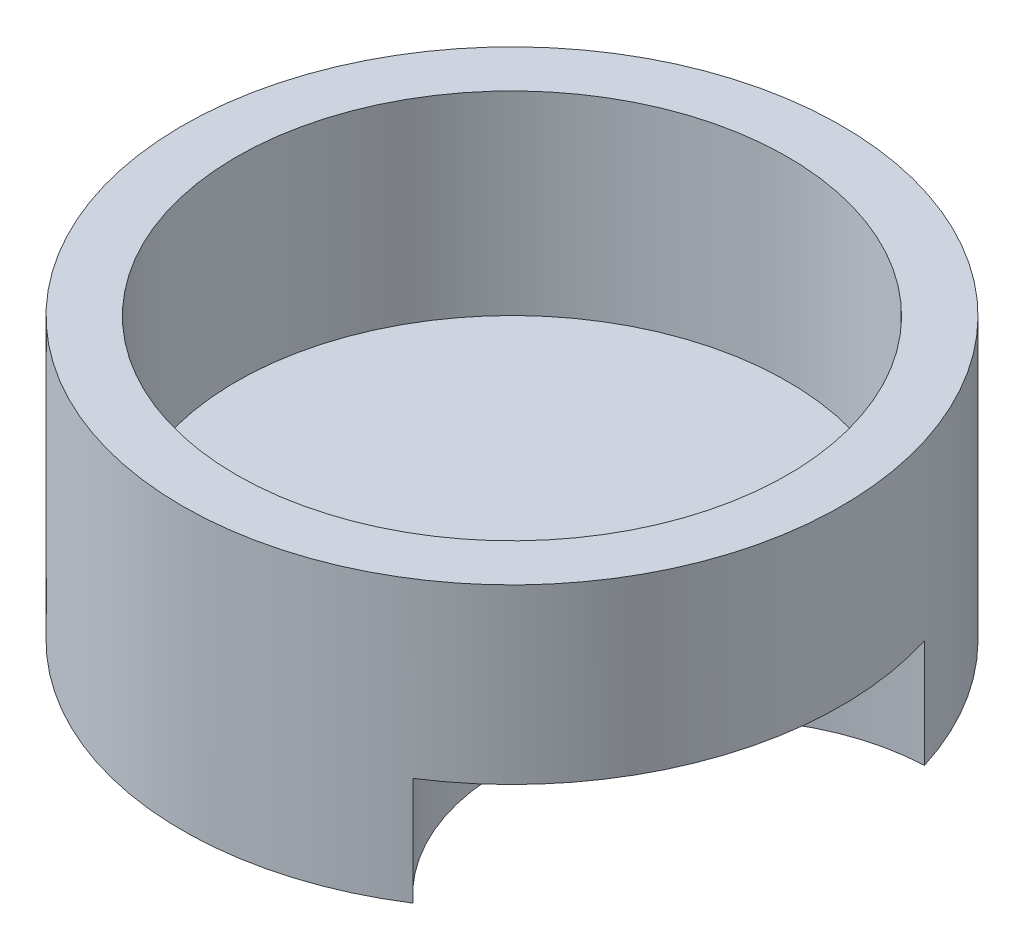
ISO-10303-21;
HEADER;
FILE_DESCRIPTION(('STEP AP214'),'2;1');
FILE_NAME('part.step','',(''),(''),'','','');
FILE_SCHEMA(('AUTOMOTIVE_DESIGN { 1 0 10303 214 1 1 1 1 }'));
ENDSEC;
DATA;
#1=APPLICATION_CONTEXT('core data for automotive mechanical design processes');
#2=APPLICATION_PROTOCOL_DEFINITION('international standard','automotive_design',2000,#1);
#3=PRODUCT_CONTEXT('',#1,'mechanical');
#4=PRODUCT('Part','Part','',(#3));
#5=PRODUCT_RELATED_PRODUCT_CATEGORY('part','',(#4));
#6=PRODUCT_DEFINITION_FORMATION('','',#4);
#7=PRODUCT_DEFINITION_CONTEXT('part definition',#1,'design');
#8=PRODUCT_DEFINITION('design','',#6,#7);
#9=PRODUCT_DEFINITION_SHAPE('','',#8);
#10=(LENGTH_UNIT() NAMED_UNIT(*) SI_UNIT(.MILLI.,.METRE.));
#11=(NAMED_UNIT(*) PLANE_ANGLE_UNIT() SI_UNIT($,.RADIAN.));
#12=(NAMED_UNIT(*) SI_UNIT($,.STERADIAN.) SOLID_ANGLE_UNIT());
#13=UNCERTAINTY_MEASURE_WITH_UNIT(LENGTH_MEASURE(1.E-05),#10,'distance_accuracy_value','');
#14=(GEOMETRIC_REPRESENTATION_CONTEXT(3) GLOBAL_UNCERTAINTY_ASSIGNED_CONTEXT((#13)) GLOBAL_UNIT_ASSIGNED_CONTEXT((#10,
#11,#12)) REPRESENTATION_CONTEXT('',''));
#15=CARTESIAN_POINT('',(0.,0.,0.));
#16=DIRECTION('',(0.,0.,1.));
#17=DIRECTION('',(1.,0.,0.));
#18=AXIS2_PLACEMENT_3D('',#15,#16,#17);
#19=CARTESIAN_POINT('',(0.,1.8,0.));
#20=DIRECTION('',(0.,1.,0.));
#21=DIRECTION('',(0.,0.,1.));
#22=AXIS2_PLACEMENT_3D('',#19,#20,#21);
#23=PLANE('',#22);
#24=CARTESIAN_POINT('',(0.,1.8,0.));
#25=DIRECTION('',(0.,1.,0.));
#26=DIRECTION('',(0.,0.,1.));
#27=AXIS2_PLACEMENT_3D('',#24,#25,#26);
#28=CIRCLE('',#27,3.05);
#29=CARTESIAN_POINT('',(0.,1.8,3.05));
#30=VERTEX_POINT('',#29);
#31=EDGE_CURVE('E43',#30,#30,#28,.T.);
#32=ORIENTED_EDGE('',*,*,#31,.T.);
#33=EDGE_LOOP('',(#32));
#34=FACE_BOUND('',#33,.T.);
#35=CARTESIAN_POINT('',(0.,1.8,0.));
#36=DIRECTION('',(0.,1.,0.));
#37=DIRECTION('',(0.,0.,1.));
#38=AXIS2_PLACEMENT_3D('',#35,#36,#37);
#39=CIRCLE('',#38,2.55);
#40=CARTESIAN_POINT('',(0.,1.8,2.55));
#41=VERTEX_POINT('',#40);
#42=EDGE_CURVE('E101',#41,#41,#39,.T.);
#43=ORIENTED_EDGE('',*,*,#42,.F.);
#44=EDGE_LOOP('',(#43));
#45=FACE_BOUND('',#44,.T.);
#46=ADVANCED_FACE('F35',(#34,#45),#23,.T.);
#47=CARTESIAN_POINT('',(0.,1.8,0.));
#48=DIRECTION('',(0.,-1.,0.));
#49=DIRECTION('',(0.,0.,-1.));
#50=AXIS2_PLACEMENT_3D('',#47,#48,#49);
#51=CYLINDRICAL_SURFACE('',#50,3.05);
#52=CARTESIAN_POINT('',(0.,-0.8,0.));
#53=DIRECTION('',(0.,-1.,0.));
#54=DIRECTION('',(0.,0.,-1.));
#55=AXIS2_PLACEMENT_3D('',#52,#53,#54);
#56=CIRCLE('',#55,3.05);
#57=CARTESIAN_POINT('',(1.64806765864692,-0.8,2.56639299261085));
#58=VERTEX_POINT('',#57);
#59=CARTESIAN_POINT('',(2.91246776280219,-0.8,-0.905555923528757));
#60=VERTEX_POINT('',#59);
#61=EDGE_CURVE('E84',#58,#60,#56,.T.);
#62=ORIENTED_EDGE('',*,*,#61,.F.);
#63=DIRECTION('',(0.,-1.,0.));
#64=VECTOR('',#63,1.);
#65=CARTESIAN_POINT('',(1.64806765864692,-0.3,2.56639299261085));
#66=LINE('',#65,#64);
#67=CARTESIAN_POINT('',(1.64806765864692,0.2,2.56639299261085));
#68=VERTEX_POINT('',#67);
#69=EDGE_CURVE('E57',#58,#68,#66,.F.);
#70=ORIENTED_EDGE('',*,*,#69,.T.);
#71=CARTESIAN_POINT('',(0.,0.2,0.));
#72=DIRECTION('',(0.,-1.,0.));
#73=DIRECTION('',(0.,0.,-1.));
#74=AXIS2_PLACEMENT_3D('',#71,#72,#73);
#75=CIRCLE('',#74,3.05);
#76=CARTESIAN_POINT('',(2.91246776280219,0.2,-0.905555923528757));
#77=VERTEX_POINT('',#76);
#78=EDGE_CURVE('E78',#77,#68,#75,.T.);
#79=ORIENTED_EDGE('',*,*,#78,.F.);
#80=DIRECTION('',(0.,-1.,0.));
#81=VECTOR('',#80,1.);
#82=CARTESIAN_POINT('',(2.91246776280219,-0.3,-0.905555923528757));
#83=LINE('',#82,#81);
#84=EDGE_CURVE('E94',#77,#60,#83,.T.);
#85=ORIENTED_EDGE('',*,*,#84,.T.);
#86=EDGE_LOOP('',(#62,#70,#79,#85));
#87=FACE_BOUND('',#86,.T.);
#88=ORIENTED_EDGE('',*,*,#31,.F.);
#89=EDGE_LOOP('',(#88));
#90=FACE_BOUND('',#89,.T.);
#91=ADVANCED_FACE('F37',(#87,#90),#51,.T.);
#92=CARTESIAN_POINT('',(0.,1.8,0.));
#93=DIRECTION('',(0.,-1.,0.));
#94=DIRECTION('',(0.,0.,-1.));
#95=AXIS2_PLACEMENT_3D('',#92,#93,#94);
#96=CYLINDRICAL_SURFACE('',#95,2.55);
#97=DIRECTION('',(0.,-1.,0.));
#98=VECTOR('',#97,1.);
#99=CARTESIAN_POINT('',(1.32188993072048,-0.3,2.18062078570755));
#100=LINE('',#99,#98);
#101=CARTESIAN_POINT('',(1.32188993072048,0.,2.18062078570755));
#102=VERTEX_POINT('',#101);
#103=CARTESIAN_POINT('',(1.32188993072048,0.2,2.18062078570755));
#104=VERTEX_POINT('',#103);
#105=EDGE_CURVE('E88',#102,#104,#100,.F.);
#106=ORIENTED_EDGE('',*,*,#105,.F.);
#107=CARTESIAN_POINT('',(0.,0.,0.));
#108=DIRECTION('',(0.,1.,0.));
#109=DIRECTION('',(0.,0.,1.));
#110=AXIS2_PLACEMENT_3D('',#107,#108,#109);
#111=CIRCLE('',#110,2.55);
#112=CARTESIAN_POINT('',(2.41460038369279,0.,-0.819881081054205));
#113=VERTEX_POINT('',#112);
#114=EDGE_CURVE('E100',#113,#102,#111,.T.);
#115=ORIENTED_EDGE('',*,*,#114,.F.);
#116=DIRECTION('',(0.,-1.,0.));
#117=VECTOR('',#116,1.);
#118=CARTESIAN_POINT('',(2.41460038369279,-0.3,-0.819881081054205));
#119=LINE('',#118,#117);
#120=CARTESIAN_POINT('',(2.41460038369279,0.2,-0.819881081054205));
#121=VERTEX_POINT('',#120);
#122=EDGE_CURVE('E50',#121,#113,#119,.T.);
#123=ORIENTED_EDGE('',*,*,#122,.F.);
#124=CARTESIAN_POINT('',(0.,0.2,0.));
#125=DIRECTION('',(0.,-1.,0.));
#126=DIRECTION('',(0.,0.,-1.));
#127=AXIS2_PLACEMENT_3D('',#124,#125,#126);
#128=CIRCLE('',#127,2.55);
#129=EDGE_CURVE('E11',#121,#104,#128,.T.);
#130=ORIENTED_EDGE('',*,*,#129,.T.);
#131=EDGE_LOOP('',(#106,#115,#123,#130));
#132=FACE_BOUND('',#131,.T.);
#133=ORIENTED_EDGE('',*,*,#42,.T.);
#134=EDGE_LOOP('',(#133));
#135=FACE_BOUND('',#134,.T.);
#136=ADVANCED_FACE('F110',(#132,#135),#96,.F.);
#137=CARTESIAN_POINT('',(0.,0.,0.));
#138=DIRECTION('',(0.,-1.,0.));
#139=DIRECTION('',(0.,0.,-1.));
#140=AXIS2_PLACEMENT_3D('',#137,#138,#139);
#141=PLANE('',#140);
#142=ORIENTED_EDGE('',*,*,#114,.T.);
#143=CARTESIAN_POINT('',(3.,0.,1.09252768519515));
#144=DIRECTION('',(0.,-1.,0.));
#145=DIRECTION('',(0.,0.,-1.));
#146=AXIS2_PLACEMENT_3D('',#143,#144,#145);
#147=CIRCLE('',#146,2.);
#148=EDGE_CURVE('E89',#102,#113,#147,.T.);
#149=ORIENTED_EDGE('',*,*,#148,.T.);
#150=EDGE_LOOP('',(#142,#149));
#151=FACE_BOUND('',#150,.T.);
#152=ADVANCED_FACE('F115',(#151),#141,.F.);
#153=CARTESIAN_POINT('',(0.,-0.8,0.));
#154=DIRECTION('',(0.,-1.,0.));
#155=DIRECTION('',(0.,0.,-1.));
#156=AXIS2_PLACEMENT_3D('',#153,#154,#155);
#157=PLANE('',#156);
#158=CARTESIAN_POINT('',(3.,-0.8,1.09252768519515));
#159=DIRECTION('',(0.,-1.,0.));
#160=DIRECTION('',(0.,0.,-1.));
#161=AXIS2_PLACEMENT_3D('',#158,#159,#160);
#162=CIRCLE('',#161,2.);
#163=EDGE_CURVE('E172',#58,#60,#162,.T.);
#164=ORIENTED_EDGE('',*,*,#163,.F.);
#165=ORIENTED_EDGE('',*,*,#61,.T.);
#166=EDGE_LOOP('',(#164,#165));
#167=FACE_BOUND('',#166,.T.);
#168=ADVANCED_FACE('F123',(#167),#157,.T.);
#169=CARTESIAN_POINT('',(3.,0.2,1.09252768519515));
#170=DIRECTION('',(0.,-1.,0.));
#171=DIRECTION('',(0.,0.,-1.));
#172=AXIS2_PLACEMENT_3D('',#169,#170,#171);
#173=PLANE('',#172);
#174=ORIENTED_EDGE('',*,*,#78,.T.);
#175=CARTESIAN_POINT('',(3.,0.2,1.09252768519515));
#176=DIRECTION('',(0.,-1.,0.));
#177=DIRECTION('',(0.,0.,-1.));
#178=AXIS2_PLACEMENT_3D('',#175,#176,#177);
#179=CIRCLE('',#178,2.);
#180=EDGE_CURVE('E80',#68,#104,#179,.T.);
#181=ORIENTED_EDGE('',*,*,#180,.T.);
#182=ORIENTED_EDGE('',*,*,#129,.F.);
#183=EDGE_CURVE('E81',#121,#77,#179,.T.);
#184=ORIENTED_EDGE('',*,*,#183,.T.);
#185=EDGE_LOOP('',(#174,#181,#182,#184));
#186=FACE_BOUND('',#185,.T.);
#187=ADVANCED_FACE('F79',(#186),#173,.T.);
#188=CARTESIAN_POINT('',(3.,0.2,1.09252768519515));
#189=DIRECTION('',(0.,-1.,0.));
#190=DIRECTION('',(0.,0.,-1.));
#191=AXIS2_PLACEMENT_3D('',#188,#189,#190);
#192=CYLINDRICAL_SURFACE('',#191,2.);
#193=ORIENTED_EDGE('',*,*,#163,.T.);
#194=ORIENTED_EDGE('',*,*,#84,.F.);
#195=ORIENTED_EDGE('',*,*,#183,.F.);
#196=ORIENTED_EDGE('',*,*,#122,.T.);
#197=ORIENTED_EDGE('',*,*,#148,.F.);
#198=ORIENTED_EDGE('',*,*,#105,.T.);
#199=ORIENTED_EDGE('',*,*,#180,.F.);
#200=ORIENTED_EDGE('',*,*,#69,.F.);
#201=EDGE_LOOP('',(#193,#194,#195,#196,#197,#198,#199,#200));
#202=FACE_BOUND('',#201,.T.);
#203=ADVANCED_FACE('F86',(#202),#192,.F.);
#204=CLOSED_SHELL('',(#46,#91,#136,#152,#168,#187,#203));
#205=MANIFOLD_SOLID_BREP('B2',#204);
#206=ADVANCED_BREP_SHAPE_REPRESENTATION('',(#18,#205),#14);
#207=SHAPE_DEFINITION_REPRESENTATION(#9,#206);
ENDSEC;
END-ISO-10303-21;
